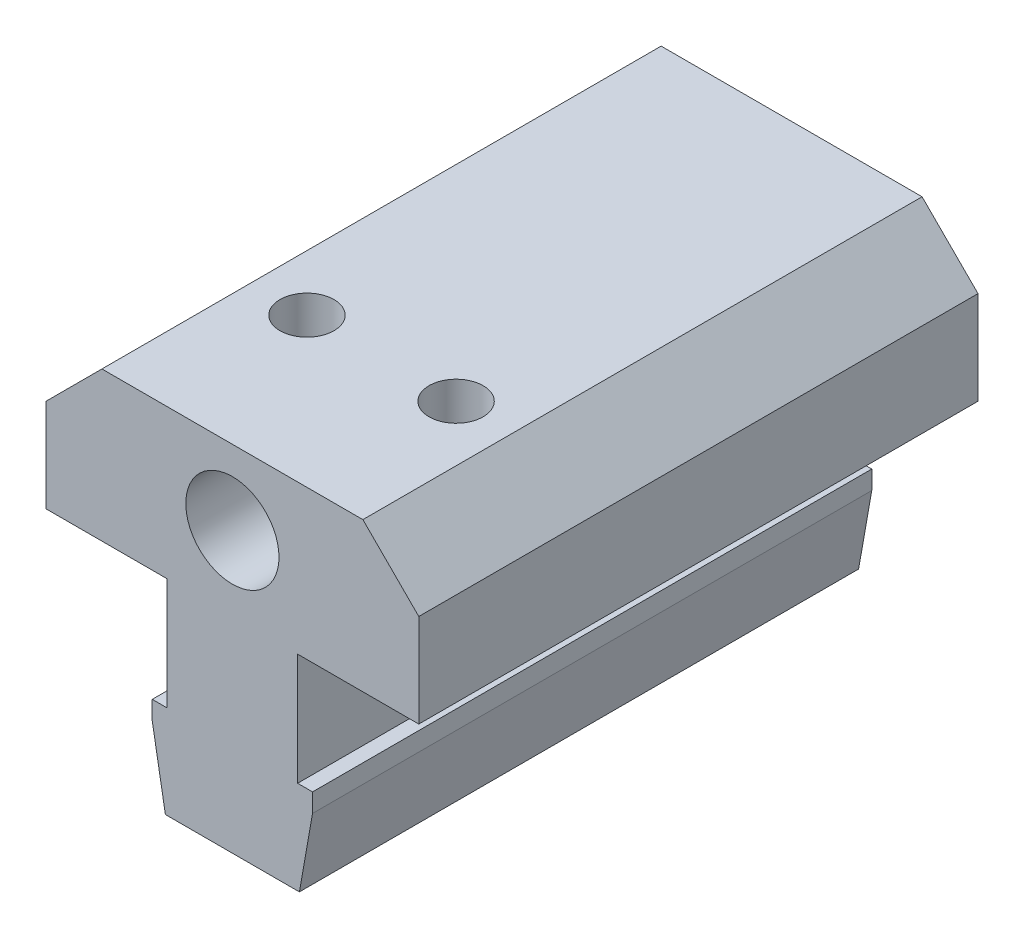
ISO-10303-21;
HEADER;
FILE_DESCRIPTION(('STEP AP214'),'2;1');
FILE_NAME('part.step','',(''),(''),'','','');
FILE_SCHEMA(('AUTOMOTIVE_DESIGN { 1 0 10303 214 1 1 1 1 }'));
ENDSEC;
DATA;
#1=APPLICATION_CONTEXT('core data for automotive mechanical design processes');
#2=APPLICATION_PROTOCOL_DEFINITION('international standard','automotive_design',2000,#1);
#3=PRODUCT_CONTEXT('',#1,'mechanical');
#4=PRODUCT('Part','Part','',(#3));
#5=PRODUCT_RELATED_PRODUCT_CATEGORY('part','',(#4));
#6=PRODUCT_DEFINITION_FORMATION('','',#4);
#7=PRODUCT_DEFINITION_CONTEXT('part definition',#1,'design');
#8=PRODUCT_DEFINITION('design','',#6,#7);
#9=PRODUCT_DEFINITION_SHAPE('','',#8);
#10=(LENGTH_UNIT() NAMED_UNIT(*) SI_UNIT(.MILLI.,.METRE.));
#11=(NAMED_UNIT(*) PLANE_ANGLE_UNIT() SI_UNIT($,.RADIAN.));
#12=(NAMED_UNIT(*) SI_UNIT($,.STERADIAN.) SOLID_ANGLE_UNIT());
#13=UNCERTAINTY_MEASURE_WITH_UNIT(LENGTH_MEASURE(1.E-05),#10,'distance_accuracy_value','');
#14=(GEOMETRIC_REPRESENTATION_CONTEXT(3) GLOBAL_UNCERTAINTY_ASSIGNED_CONTEXT((#13)) GLOBAL_UNIT_ASSIGNED_CONTEXT((#10,
#11,#12)) REPRESENTATION_CONTEXT('',''));
#15=CARTESIAN_POINT('',(0.,0.,0.));
#16=DIRECTION('',(0.,0.,1.));
#17=DIRECTION('',(1.,0.,0.));
#18=AXIS2_PLACEMENT_3D('',#15,#16,#17);
#19=CARTESIAN_POINT('',(0.,-8.,30.));
#20=DIRECTION('',(1.,0.,0.));
#21=DIRECTION('',(0.,0.,-1.));
#22=AXIS2_PLACEMENT_3D('',#19,#20,#21);
#23=PLANE('',#22);
#24=DIRECTION('',(0.,-1.,0.));
#25=VECTOR('',#24,1.);
#26=CARTESIAN_POINT('',(0.,-8.,30.));
#27=LINE('',#26,#25);
#28=CARTESIAN_POINT('',(0.,-3.00000000000001,30.));
#29=VERTEX_POINT('',#28);
#30=CARTESIAN_POINT('',(0.,-8.,30.));
#31=VERTEX_POINT('',#30);
#32=EDGE_CURVE('E248',#29,#31,#27,.T.);
#33=ORIENTED_EDGE('',*,*,#32,.F.);
#34=DIRECTION('',(0.,0.,-1.));
#35=VECTOR('',#34,1.);
#36=CARTESIAN_POINT('',(0.,-3.00000000000001,30.));
#37=LINE('',#36,#35);
#38=CARTESIAN_POINT('',(0.,-3.00000000000001,0.));
#39=VERTEX_POINT('',#38);
#40=EDGE_CURVE('E383',#29,#39,#37,.T.);
#41=ORIENTED_EDGE('',*,*,#40,.T.);
#42=DIRECTION('',(0.,-1.,0.));
#43=VECTOR('',#42,1.);
#44=CARTESIAN_POINT('',(0.,-8.,0.));
#45=LINE('',#44,#43);
#46=CARTESIAN_POINT('',(0.,-8.,0.));
#47=VERTEX_POINT('',#46);
#48=EDGE_CURVE('E281',#39,#47,#45,.T.);
#49=ORIENTED_EDGE('',*,*,#48,.T.);
#50=DIRECTION('',(0.,0.,-1.));
#51=VECTOR('',#50,1.);
#52=CARTESIAN_POINT('',(0.,-8.,30.));
#53=LINE('',#52,#51);
#54=EDGE_CURVE('E207',#31,#47,#53,.T.);
#55=ORIENTED_EDGE('',*,*,#54,.F.);
#56=EDGE_LOOP('',(#33,#41,#49,#55));
#57=FACE_BOUND('',#56,.T.);
#58=ADVANCED_FACE('F47',(#57),#23,.F.);
#59=CARTESIAN_POINT('',(6.5,-8.,30.));
#60=DIRECTION('',(0.,1.,0.));
#61=DIRECTION('',(0.,0.,1.));
#62=AXIS2_PLACEMENT_3D('',#59,#60,#61);
#63=PLANE('',#62);
#64=DIRECTION('',(0.,0.,-1.));
#65=VECTOR('',#64,1.);
#66=CARTESIAN_POINT('',(6.5,-8.,30.));
#67=LINE('',#66,#65);
#68=CARTESIAN_POINT('',(6.5,-8.,20.6389342411184));
#69=VERTEX_POINT('',#68);
#70=CARTESIAN_POINT('',(6.5,-8.,0.));
#71=VERTEX_POINT('',#70);
#72=EDGE_CURVE('E184',#69,#71,#67,.T.);
#73=ORIENTED_EDGE('',*,*,#72,.F.);
#74=CARTESIAN_POINT('',(6.,-8.,22.));
#75=DIRECTION('',(0.,1.,0.));
#76=DIRECTION('',(0.,0.,1.));
#77=AXIS2_PLACEMENT_3D('',#74,#75,#76);
#78=CIRCLE('',#77,1.45);
#79=CARTESIAN_POINT('',(6.5,-8.,23.3610657588816));
#80=VERTEX_POINT('',#79);
#81=EDGE_CURVE('E190',#69,#80,#78,.T.);
#82=ORIENTED_EDGE('',*,*,#81,.T.);
#83=CARTESIAN_POINT('',(6.5,-8.,30.));
#84=VERTEX_POINT('',#83);
#85=EDGE_CURVE('E183',#84,#80,#67,.T.);
#86=ORIENTED_EDGE('',*,*,#85,.F.);
#87=DIRECTION('',(1.,0.,0.));
#88=VECTOR('',#87,1.);
#89=CARTESIAN_POINT('',(6.5,-8.,30.));
#90=LINE('',#89,#88);
#91=EDGE_CURVE('E315',#31,#84,#90,.T.);
#92=ORIENTED_EDGE('',*,*,#91,.F.);
#93=ORIENTED_EDGE('',*,*,#54,.T.);
#94=DIRECTION('',(1.,0.,0.));
#95=VECTOR('',#94,1.);
#96=CARTESIAN_POINT('',(6.5,-8.,0.));
#97=LINE('',#96,#95);
#98=EDGE_CURVE('E278',#47,#71,#97,.T.);
#99=ORIENTED_EDGE('',*,*,#98,.T.);
#100=EDGE_LOOP('',(#73,#82,#86,#92,#93,#99));
#101=FACE_BOUND('',#100,.T.);
#102=ADVANCED_FACE('F197',(#101),#63,.F.);
#103=CARTESIAN_POINT('',(6.5,-14.,30.));
#104=DIRECTION('',(1.,0.,0.));
#105=DIRECTION('',(0.,1.,0.));
#106=AXIS2_PLACEMENT_3D('',#103,#104,#105);
#107=PLANE('',#106);
#108=DIRECTION('',(0.,-1.,0.));
#109=VECTOR('',#108,1.);
#110=CARTESIAN_POINT('',(6.5,-14.,0.));
#111=LINE('',#110,#109);
#112=CARTESIAN_POINT('',(6.5,-14.,0.));
#113=VERTEX_POINT('',#112);
#114=EDGE_CURVE('E275',#71,#113,#111,.T.);
#115=ORIENTED_EDGE('',*,*,#114,.T.);
#116=DIRECTION('',(0.,0.,-1.));
#117=VECTOR('',#116,1.);
#118=CARTESIAN_POINT('',(6.5,-14.,30.));
#119=LINE('',#118,#117);
#120=CARTESIAN_POINT('',(6.5,-14.,30.));
#121=VERTEX_POINT('',#120);
#122=EDGE_CURVE('E214',#121,#113,#119,.T.);
#123=ORIENTED_EDGE('',*,*,#122,.F.);
#124=DIRECTION('',(0.,-1.,0.));
#125=VECTOR('',#124,1.);
#126=CARTESIAN_POINT('',(6.5,-14.,30.));
#127=LINE('',#126,#125);
#128=EDGE_CURVE('E205',#84,#121,#127,.T.);
#129=ORIENTED_EDGE('',*,*,#128,.F.);
#130=ORIENTED_EDGE('',*,*,#85,.T.);
#131=EDGE_CURVE('E175',#80,#69,#67,.T.);
#132=ORIENTED_EDGE('',*,*,#131,.T.);
#133=ORIENTED_EDGE('',*,*,#72,.T.);
#134=EDGE_LOOP('',(#115,#123,#129,#130,#132,#133));
#135=FACE_BOUND('',#134,.T.);
#136=ADVANCED_FACE('F203',(#135),#107,.F.);
#137=CARTESIAN_POINT('',(5.7,-14.,30.));
#138=DIRECTION('',(0.,-1.,0.));
#139=DIRECTION('',(1.,0.,0.));
#140=AXIS2_PLACEMENT_3D('',#137,#138,#139);
#141=PLANE('',#140);
#142=DIRECTION('',(-1.,0.,0.));
#143=VECTOR('',#142,1.);
#144=CARTESIAN_POINT('',(5.7,-14.,0.));
#145=LINE('',#144,#143);
#146=CARTESIAN_POINT('',(5.7,-14.,0.));
#147=VERTEX_POINT('',#146);
#148=EDGE_CURVE('E272',#113,#147,#145,.T.);
#149=ORIENTED_EDGE('',*,*,#148,.T.);
#150=DIRECTION('',(0.,0.,-1.));
#151=VECTOR('',#150,1.);
#152=CARTESIAN_POINT('',(5.7,-14.,30.));
#153=LINE('',#152,#151);
#154=CARTESIAN_POINT('',(5.7,-14.,30.));
#155=VERTEX_POINT('',#154);
#156=EDGE_CURVE('E217',#155,#147,#153,.T.);
#157=ORIENTED_EDGE('',*,*,#156,.F.);
#158=DIRECTION('',(-1.,0.,0.));
#159=VECTOR('',#158,1.);
#160=CARTESIAN_POINT('',(5.7,-14.,30.));
#161=LINE('',#160,#159);
#162=EDGE_CURVE('E310',#121,#155,#161,.T.);
#163=ORIENTED_EDGE('',*,*,#162,.F.);
#164=ORIENTED_EDGE('',*,*,#122,.T.);
#165=EDGE_LOOP('',(#149,#157,#163,#164));
#166=FACE_BOUND('',#165,.T.);
#167=ADVANCED_FACE('F425',(#166),#141,.F.);
#168=CARTESIAN_POINT('',(5.7,-19.,30.));
#169=DIRECTION('',(1.,0.,0.));
#170=DIRECTION('',(0.,0.,-1.));
#171=AXIS2_PLACEMENT_3D('',#168,#169,#170);
#172=PLANE('',#171);
#173=DIRECTION('',(0.,-1.,0.));
#174=VECTOR('',#173,1.);
#175=CARTESIAN_POINT('',(5.7,-19.,0.));
#176=LINE('',#175,#174);
#177=CARTESIAN_POINT('',(5.7,-14.9999999999999,0.));
#178=VERTEX_POINT('',#177);
#179=EDGE_CURVE('E269',#147,#178,#176,.T.);
#180=ORIENTED_EDGE('',*,*,#179,.T.);
#181=DIRECTION('',(0.,0.,1.));
#182=VECTOR('',#181,1.);
#183=CARTESIAN_POINT('',(5.7,-14.9999999999999,30.));
#184=LINE('',#183,#182);
#185=CARTESIAN_POINT('',(5.7,-14.9999999999999,30.));
#186=VERTEX_POINT('',#185);
#187=EDGE_CURVE('E11',#178,#186,#184,.T.);
#188=ORIENTED_EDGE('',*,*,#187,.T.);
#189=DIRECTION('',(0.,-1.,0.));
#190=VECTOR('',#189,1.);
#191=CARTESIAN_POINT('',(5.7,-19.,30.));
#192=LINE('',#191,#190);
#193=EDGE_CURVE('E307',#155,#186,#192,.T.);
#194=ORIENTED_EDGE('',*,*,#193,.F.);
#195=ORIENTED_EDGE('',*,*,#156,.T.);
#196=EDGE_LOOP('',(#180,#188,#194,#195));
#197=FACE_BOUND('',#196,.T.);
#198=ADVANCED_FACE('F427',(#197),#172,.F.);
#199=CARTESIAN_POINT('',(14.3,-19.,30.));
#200=DIRECTION('',(0.,1.,0.));
#201=DIRECTION('',(0.,0.,1.));
#202=AXIS2_PLACEMENT_3D('',#199,#200,#201);
#203=PLANE('',#202);
#204=DIRECTION('',(1.,0.,0.));
#205=VECTOR('',#204,1.);
#206=CARTESIAN_POINT('',(14.3,-19.,0.));
#207=LINE('',#206,#205);
#208=CARTESIAN_POINT('',(6.40530792283387,-19.,0.));
#209=VERTEX_POINT('',#208);
#210=CARTESIAN_POINT('',(13.5946920771661,-19.,0.));
#211=VERTEX_POINT('',#210);
#212=EDGE_CURVE('E266',#209,#211,#207,.T.);
#213=ORIENTED_EDGE('',*,*,#212,.T.);
#214=DIRECTION('',(0.,0.,1.));
#215=VECTOR('',#214,1.);
#216=CARTESIAN_POINT('',(13.5946920771661,-19.,30.));
#217=LINE('',#216,#215);
#218=CARTESIAN_POINT('',(13.5946920771661,-19.,30.));
#219=VERTEX_POINT('',#218);
#220=EDGE_CURVE('E70',#211,#219,#217,.T.);
#221=ORIENTED_EDGE('',*,*,#220,.T.);
#222=DIRECTION('',(1.,0.,0.));
#223=VECTOR('',#222,1.);
#224=CARTESIAN_POINT('',(14.3,-19.,30.));
#225=LINE('',#224,#223);
#226=CARTESIAN_POINT('',(6.40530792283387,-19.,30.));
#227=VERTEX_POINT('',#226);
#228=EDGE_CURVE('E304',#227,#219,#225,.T.);
#229=ORIENTED_EDGE('',*,*,#228,.F.);
#230=DIRECTION('',(0.,0.,-1.));
#231=VECTOR('',#230,1.);
#232=CARTESIAN_POINT('',(6.40530792283387,-19.,30.));
#233=LINE('',#232,#231);
#234=EDGE_CURVE('E372',#227,#209,#233,.T.);
#235=ORIENTED_EDGE('',*,*,#234,.T.);
#236=EDGE_LOOP('',(#213,#221,#229,#235));
#237=FACE_BOUND('',#236,.T.);
#238=ADVANCED_FACE('F430',(#237),#203,.F.);
#239=CARTESIAN_POINT('',(14.3,-14.,30.));
#240=DIRECTION('',(-1.,0.,0.));
#241=DIRECTION('',(0.,0.,1.));
#242=AXIS2_PLACEMENT_3D('',#239,#240,#241);
#243=PLANE('',#242);
#244=DIRECTION('',(0.,1.,0.));
#245=VECTOR('',#244,1.);
#246=CARTESIAN_POINT('',(14.3,-14.,30.));
#247=LINE('',#246,#245);
#248=CARTESIAN_POINT('',(14.3,-14.9999999999999,30.));
#249=VERTEX_POINT('',#248);
#250=CARTESIAN_POINT('',(14.3,-14.,30.));
#251=VERTEX_POINT('',#250);
#252=EDGE_CURVE('E301',#249,#251,#247,.T.);
#253=ORIENTED_EDGE('',*,*,#252,.F.);
#254=DIRECTION('',(0.,0.,-1.));
#255=VECTOR('',#254,1.);
#256=CARTESIAN_POINT('',(14.3,-14.9999999999999,30.));
#257=LINE('',#256,#255);
#258=CARTESIAN_POINT('',(14.3,-14.9999999999999,0.));
#259=VERTEX_POINT('',#258);
#260=EDGE_CURVE('E365',#249,#259,#257,.T.);
#261=ORIENTED_EDGE('',*,*,#260,.T.);
#262=DIRECTION('',(0.,1.,0.));
#263=VECTOR('',#262,1.);
#264=CARTESIAN_POINT('',(14.3,-14.,0.));
#265=LINE('',#264,#263);
#266=CARTESIAN_POINT('',(14.3,-14.,0.));
#267=VERTEX_POINT('',#266);
#268=EDGE_CURVE('E263',#259,#267,#265,.T.);
#269=ORIENTED_EDGE('',*,*,#268,.T.);
#270=DIRECTION('',(0.,0.,-1.));
#271=VECTOR('',#270,1.);
#272=CARTESIAN_POINT('',(14.3,-14.,30.));
#273=LINE('',#272,#271);
#274=EDGE_CURVE('E223',#251,#267,#273,.T.);
#275=ORIENTED_EDGE('',*,*,#274,.F.);
#276=EDGE_LOOP('',(#253,#261,#269,#275));
#277=FACE_BOUND('',#276,.T.);
#278=ADVANCED_FACE('F433',(#277),#243,.F.);
#279=CARTESIAN_POINT('',(13.5,-14.,30.));
#280=DIRECTION('',(0.,-1.,0.));
#281=DIRECTION('',(1.,0.,0.));
#282=AXIS2_PLACEMENT_3D('',#279,#280,#281);
#283=PLANE('',#282);
#284=DIRECTION('',(-1.,0.,0.));
#285=VECTOR('',#284,1.);
#286=CARTESIAN_POINT('',(13.5,-14.,0.));
#287=LINE('',#286,#285);
#288=CARTESIAN_POINT('',(13.5,-14.,0.));
#289=VERTEX_POINT('',#288);
#290=EDGE_CURVE('E260',#267,#289,#287,.T.);
#291=ORIENTED_EDGE('',*,*,#290,.T.);
#292=DIRECTION('',(0.,0.,-1.));
#293=VECTOR('',#292,1.);
#294=CARTESIAN_POINT('',(13.5,-14.,30.));
#295=LINE('',#294,#293);
#296=CARTESIAN_POINT('',(13.5,-14.,30.));
#297=VERTEX_POINT('',#296);
#298=EDGE_CURVE('E229',#297,#289,#295,.T.);
#299=ORIENTED_EDGE('',*,*,#298,.F.);
#300=DIRECTION('',(-1.,0.,0.));
#301=VECTOR('',#300,1.);
#302=CARTESIAN_POINT('',(13.5,-14.,30.));
#303=LINE('',#302,#301);
#304=EDGE_CURVE('E298',#251,#297,#303,.T.);
#305=ORIENTED_EDGE('',*,*,#304,.F.);
#306=ORIENTED_EDGE('',*,*,#274,.T.);
#307=EDGE_LOOP('',(#291,#299,#305,#306));
#308=FACE_BOUND('',#307,.T.);
#309=ADVANCED_FACE('F440',(#308),#283,.F.);
#310=CARTESIAN_POINT('',(13.5,-8.,30.));
#311=DIRECTION('',(-1.,0.,0.));
#312=DIRECTION('',(0.,-1.,0.));
#313=AXIS2_PLACEMENT_3D('',#310,#311,#312);
#314=PLANE('',#313);
#315=DIRECTION('',(0.,1.,0.));
#316=VECTOR('',#315,1.);
#317=CARTESIAN_POINT('',(13.5,-8.,0.));
#318=LINE('',#317,#316);
#319=CARTESIAN_POINT('',(13.5,-8.,0.));
#320=VERTEX_POINT('',#319);
#321=EDGE_CURVE('E256',#289,#320,#318,.T.);
#322=ORIENTED_EDGE('',*,*,#321,.T.);
#323=DIRECTION('',(0.,0.,-1.));
#324=VECTOR('',#323,1.);
#325=CARTESIAN_POINT('',(13.5,-8.,30.));
#326=LINE('',#325,#324);
#327=CARTESIAN_POINT('',(13.5,-8.,20.6389342411184));
#328=VERTEX_POINT('',#327);
#329=EDGE_CURVE('E238',#328,#320,#326,.T.);
#330=ORIENTED_EDGE('',*,*,#329,.F.);
#331=CARTESIAN_POINT('',(13.5,-8.,23.3610657588816));
#332=VERTEX_POINT('',#331);
#333=EDGE_CURVE('E237',#332,#328,#326,.T.);
#334=ORIENTED_EDGE('',*,*,#333,.F.);
#335=CARTESIAN_POINT('',(13.5,-8.,30.));
#336=VERTEX_POINT('',#335);
#337=EDGE_CURVE('E233',#336,#332,#326,.T.);
#338=ORIENTED_EDGE('',*,*,#337,.F.);
#339=DIRECTION('',(0.,1.,0.));
#340=VECTOR('',#339,1.);
#341=CARTESIAN_POINT('',(13.5,-8.,30.));
#342=LINE('',#341,#340);
#343=EDGE_CURVE('E295',#297,#336,#342,.T.);
#344=ORIENTED_EDGE('',*,*,#343,.F.);
#345=ORIENTED_EDGE('',*,*,#298,.T.);
#346=EDGE_LOOP('',(#322,#330,#334,#338,#344,#345));
#347=FACE_BOUND('',#346,.T.);
#348=ADVANCED_FACE('F443',(#347),#314,.F.);
#349=CARTESIAN_POINT('',(20.,-8.,30.));
#350=DIRECTION('',(0.,1.,0.));
#351=DIRECTION('',(0.,0.,1.));
#352=AXIS2_PLACEMENT_3D('',#349,#350,#351);
#353=PLANE('',#352);
#354=ORIENTED_EDGE('',*,*,#337,.T.);
#355=CARTESIAN_POINT('',(14.,-8.,22.));
#356=DIRECTION('',(0.,1.,0.));
#357=DIRECTION('',(0.,0.,1.));
#358=AXIS2_PLACEMENT_3D('',#355,#356,#357);
#359=CIRCLE('',#358,1.45);
#360=EDGE_CURVE('E327',#332,#328,#359,.T.);
#361=ORIENTED_EDGE('',*,*,#360,.T.);
#362=ORIENTED_EDGE('',*,*,#329,.T.);
#363=DIRECTION('',(1.,0.,0.));
#364=VECTOR('',#363,1.);
#365=CARTESIAN_POINT('',(20.,-8.,0.));
#366=LINE('',#365,#364);
#367=CARTESIAN_POINT('',(20.,-8.,0.));
#368=VERTEX_POINT('',#367);
#369=EDGE_CURVE('E253',#320,#368,#366,.T.);
#370=ORIENTED_EDGE('',*,*,#369,.T.);
#371=DIRECTION('',(0.,0.,-1.));
#372=VECTOR('',#371,1.);
#373=CARTESIAN_POINT('',(20.,-8.,30.));
#374=LINE('',#373,#372);
#375=CARTESIAN_POINT('',(20.,-8.,30.));
#376=VERTEX_POINT('',#375);
#377=EDGE_CURVE('E239',#376,#368,#374,.T.);
#378=ORIENTED_EDGE('',*,*,#377,.F.);
#379=DIRECTION('',(1.,0.,0.));
#380=VECTOR('',#379,1.);
#381=CARTESIAN_POINT('',(20.,-8.,30.));
#382=LINE('',#381,#380);
#383=EDGE_CURVE('E292',#336,#376,#382,.T.);
#384=ORIENTED_EDGE('',*,*,#383,.F.);
#385=EDGE_LOOP('',(#354,#361,#362,#370,#378,#384));
#386=FACE_BOUND('',#385,.T.);
#387=ADVANCED_FACE('F451',(#386),#353,.F.);
#388=CARTESIAN_POINT('',(20.,0.,30.));
#389=DIRECTION('',(-1.,0.,0.));
#390=DIRECTION('',(0.,-1.,0.));
#391=AXIS2_PLACEMENT_3D('',#388,#389,#390);
#392=PLANE('',#391);
#393=DIRECTION('',(0.,1.,0.));
#394=VECTOR('',#393,1.);
#395=CARTESIAN_POINT('',(20.,0.,0.));
#396=LINE('',#395,#394);
#397=CARTESIAN_POINT('',(20.,-3.00000000000001,0.));
#398=VERTEX_POINT('',#397);
#399=EDGE_CURVE('E249',#368,#398,#396,.T.);
#400=ORIENTED_EDGE('',*,*,#399,.T.);
#401=DIRECTION('',(0.,0.,1.));
#402=VECTOR('',#401,1.);
#403=CARTESIAN_POINT('',(20.,-3.00000000000001,30.));
#404=LINE('',#403,#402);
#405=CARTESIAN_POINT('',(20.,-3.00000000000001,30.));
#406=VERTEX_POINT('',#405);
#407=EDGE_CURVE('E393',#398,#406,#404,.T.);
#408=ORIENTED_EDGE('',*,*,#407,.T.);
#409=DIRECTION('',(0.,1.,0.));
#410=VECTOR('',#409,1.);
#411=CARTESIAN_POINT('',(20.,0.,30.));
#412=LINE('',#411,#410);
#413=EDGE_CURVE('E288',#376,#406,#412,.T.);
#414=ORIENTED_EDGE('',*,*,#413,.F.);
#415=ORIENTED_EDGE('',*,*,#377,.T.);
#416=EDGE_LOOP('',(#400,#408,#414,#415));
#417=FACE_BOUND('',#416,.T.);
#418=ADVANCED_FACE('F458',(#417),#392,.F.);
#419=CARTESIAN_POINT('',(0.,0.,30.));
#420=DIRECTION('',(0.,-1.,0.));
#421=DIRECTION('',(0.,0.,-1.));
#422=AXIS2_PLACEMENT_3D('',#419,#420,#421);
#423=PLANE('',#422);
#424=CARTESIAN_POINT('',(14.,0.,22.));
#425=DIRECTION('',(0.,1.,0.));
#426=DIRECTION('',(0.,0.,1.));
#427=AXIS2_PLACEMENT_3D('',#424,#425,#426);
#428=CIRCLE('',#427,1.45);
#429=CARTESIAN_POINT('',(14.,0.,23.45));
#430=VERTEX_POINT('',#429);
#431=EDGE_CURVE('E323',#430,#430,#428,.T.);
#432=ORIENTED_EDGE('',*,*,#431,.F.);
#433=EDGE_LOOP('',(#432));
#434=FACE_BOUND('',#433,.T.);
#435=CARTESIAN_POINT('',(6.,0.,22.));
#436=DIRECTION('',(0.,1.,0.));
#437=DIRECTION('',(0.,0.,1.));
#438=AXIS2_PLACEMENT_3D('',#435,#436,#437);
#439=CIRCLE('',#438,1.45);
#440=CARTESIAN_POINT('',(6.,0.,23.45));
#441=VERTEX_POINT('',#440);
#442=EDGE_CURVE('E193',#441,#441,#439,.T.);
#443=ORIENTED_EDGE('',*,*,#442,.F.);
#444=EDGE_LOOP('',(#443));
#445=FACE_BOUND('',#444,.T.);
#446=DIRECTION('',(-1.,0.,0.));
#447=VECTOR('',#446,1.);
#448=CARTESIAN_POINT('',(0.,0.,30.));
#449=LINE('',#448,#447);
#450=CARTESIAN_POINT('',(17.,0.,30.));
#451=VERTEX_POINT('',#450);
#452=CARTESIAN_POINT('',(3.00000000000001,0.,30.));
#453=VERTEX_POINT('',#452);
#454=EDGE_CURVE('E243',#451,#453,#449,.T.);
#455=ORIENTED_EDGE('',*,*,#454,.F.);
#456=DIRECTION('',(0.,0.,-1.));
#457=VECTOR('',#456,1.);
#458=CARTESIAN_POINT('',(17.,0.,30.));
#459=LINE('',#458,#457);
#460=CARTESIAN_POINT('',(17.,0.,0.));
#461=VERTEX_POINT('',#460);
#462=EDGE_CURVE('E402',#451,#461,#459,.T.);
#463=ORIENTED_EDGE('',*,*,#462,.T.);
#464=DIRECTION('',(-1.,0.,0.));
#465=VECTOR('',#464,1.);
#466=CARTESIAN_POINT('',(0.,0.,0.));
#467=LINE('',#466,#465);
#468=CARTESIAN_POINT('',(3.00000000000001,0.,0.));
#469=VERTEX_POINT('',#468);
#470=EDGE_CURVE('E244',#461,#469,#467,.T.);
#471=ORIENTED_EDGE('',*,*,#470,.T.);
#472=DIRECTION('',(0.,0.,1.));
#473=VECTOR('',#472,1.);
#474=CARTESIAN_POINT('',(3.00000000000001,0.,30.));
#475=LINE('',#474,#473);
#476=EDGE_CURVE('E210',#469,#453,#475,.T.);
#477=ORIENTED_EDGE('',*,*,#476,.T.);
#478=EDGE_LOOP('',(#455,#463,#471,#477));
#479=FACE_BOUND('',#478,.T.);
#480=ADVANCED_FACE('F353',(#434,#445,#479),#423,.F.);
#481=CARTESIAN_POINT('',(0.,0.,30.));
#482=DIRECTION('',(0.,0.,-1.));
#483=DIRECTION('',(-1.,0.,0.));
#484=AXIS2_PLACEMENT_3D('',#481,#482,#483);
#485=PLANE('',#484);
#486=CARTESIAN_POINT('',(10.,-4.,30.));
#487=DIRECTION('',(0.,0.,1.));
#488=DIRECTION('',(1.,0.,0.));
#489=AXIS2_PLACEMENT_3D('',#486,#487,#488);
#490=CIRCLE('',#489,2.5);
#491=CARTESIAN_POINT('',(12.5,-4.,30.));
#492=VERTEX_POINT('',#491);
#493=EDGE_CURVE('E331',#492,#492,#490,.T.);
#494=ORIENTED_EDGE('',*,*,#493,.F.);
#495=EDGE_LOOP('',(#494));
#496=FACE_BOUND('',#495,.T.);
#497=ORIENTED_EDGE('',*,*,#228,.T.);
#498=DIRECTION('',(-0.173648177666928,-0.984807753012209,0.));
#499=VECTOR('',#498,1.);
#500=CARTESIAN_POINT('',(14.3,-14.9999999999999,30.));
#501=LINE('',#500,#499);
#502=EDGE_CURVE('E57',#219,#249,#501,.F.);
#503=ORIENTED_EDGE('',*,*,#502,.T.);
#504=ORIENTED_EDGE('',*,*,#252,.T.);
#505=ORIENTED_EDGE('',*,*,#304,.T.);
#506=ORIENTED_EDGE('',*,*,#343,.T.);
#507=ORIENTED_EDGE('',*,*,#383,.T.);
#508=ORIENTED_EDGE('',*,*,#413,.T.);
#509=DIRECTION('',(0.707106781186548,-0.707106781186548,0.));
#510=VECTOR('',#509,1.);
#511=CARTESIAN_POINT('',(17.,0.,30.));
#512=LINE('',#511,#510);
#513=EDGE_CURVE('E387',#406,#451,#512,.F.);
#514=ORIENTED_EDGE('',*,*,#513,.T.);
#515=ORIENTED_EDGE('',*,*,#454,.T.);
#516=DIRECTION('',(0.707106781186548,0.707106781186548,0.));
#517=VECTOR('',#516,1.);
#518=CARTESIAN_POINT('',(0.,-3.00000000000001,30.));
#519=LINE('',#518,#517);
#520=EDGE_CURVE('E390',#453,#29,#519,.F.);
#521=ORIENTED_EDGE('',*,*,#520,.T.);
#522=ORIENTED_EDGE('',*,*,#32,.T.);
#523=ORIENTED_EDGE('',*,*,#91,.T.);
#524=ORIENTED_EDGE('',*,*,#128,.T.);
#525=ORIENTED_EDGE('',*,*,#162,.T.);
#526=ORIENTED_EDGE('',*,*,#193,.T.);
#527=DIRECTION('',(-0.173648177666928,0.984807753012209,0.));
#528=VECTOR('',#527,1.);
#529=CARTESIAN_POINT('',(6.40530792283387,-19.,30.));
#530=LINE('',#529,#528);
#531=EDGE_CURVE('E358',#186,#227,#530,.F.);
#532=ORIENTED_EDGE('',*,*,#531,.T.);
#533=EDGE_LOOP('',(#497,#503,#504,#505,#506,#507,#508,#514,#515,#521,#522,#523,#524,#525,#526,#532));
#534=FACE_BOUND('',#533,.T.);
#535=ADVANCED_FACE('F350',(#496,#534),#485,.F.);
#536=CARTESIAN_POINT('',(0.,0.,0.));
#537=DIRECTION('',(0.,0.,-1.));
#538=DIRECTION('',(-1.,0.,0.));
#539=AXIS2_PLACEMENT_3D('',#536,#537,#538);
#540=PLANE('',#539);
#541=CARTESIAN_POINT('',(10.,-4.,0.));
#542=DIRECTION('',(0.,0.,1.));
#543=DIRECTION('',(1.,0.,0.));
#544=AXIS2_PLACEMENT_3D('',#541,#542,#543);
#545=CIRCLE('',#544,2.5);
#546=CARTESIAN_POINT('',(12.5,-4.,0.));
#547=VERTEX_POINT('',#546);
#548=EDGE_CURVE('E202',#547,#547,#545,.T.);
#549=ORIENTED_EDGE('',*,*,#548,.T.);
#550=EDGE_LOOP('',(#549));
#551=FACE_BOUND('',#550,.T.);
#552=ORIENTED_EDGE('',*,*,#268,.F.);
#553=DIRECTION('',(0.173648177666928,0.984807753012209,0.));
#554=VECTOR('',#553,1.);
#555=CARTESIAN_POINT('',(16.4339533135617,-2.89774936888417,0.));
#556=LINE('',#555,#554);
#557=EDGE_CURVE('E375',#259,#211,#556,.F.);
#558=ORIENTED_EDGE('',*,*,#557,.T.);
#559=ORIENTED_EDGE('',*,*,#212,.F.);
#560=DIRECTION('',(0.173648177666928,-0.984807753012209,0.));
#561=VECTOR('',#560,1.);
#562=CARTESIAN_POINT('',(2.96297289429738,0.522452064372471,0.));
#563=LINE('',#562,#561);
#564=EDGE_CURVE('E378',#209,#178,#563,.F.);
#565=ORIENTED_EDGE('',*,*,#564,.T.);
#566=ORIENTED_EDGE('',*,*,#179,.F.);
#567=ORIENTED_EDGE('',*,*,#148,.F.);
#568=ORIENTED_EDGE('',*,*,#114,.F.);
#569=ORIENTED_EDGE('',*,*,#98,.F.);
#570=ORIENTED_EDGE('',*,*,#48,.F.);
#571=DIRECTION('',(-0.707106781186548,-0.707106781186548,0.));
#572=VECTOR('',#571,1.);
#573=CARTESIAN_POINT('',(1.50000000000001,-1.50000000000001,0.));
#574=LINE('',#573,#572);
#575=EDGE_CURVE('E399',#39,#469,#574,.F.);
#576=ORIENTED_EDGE('',*,*,#575,.T.);
#577=ORIENTED_EDGE('',*,*,#470,.F.);
#578=DIRECTION('',(-0.707106781186548,0.707106781186548,0.));
#579=VECTOR('',#578,1.);
#580=CARTESIAN_POINT('',(8.49999999999999,8.49999999999999,0.));
#581=LINE('',#580,#579);
#582=EDGE_CURVE('E396',#461,#398,#581,.F.);
#583=ORIENTED_EDGE('',*,*,#582,.T.);
#584=ORIENTED_EDGE('',*,*,#399,.F.);
#585=ORIENTED_EDGE('',*,*,#369,.F.);
#586=ORIENTED_EDGE('',*,*,#321,.F.);
#587=ORIENTED_EDGE('',*,*,#290,.F.);
#588=EDGE_LOOP('',(#552,#558,#559,#565,#566,#567,#568,#569,#570,#576,#577,#583,#584,#585,#586,#587));
#589=FACE_BOUND('',#588,.T.);
#590=ADVANCED_FACE('F339',(#551,#589),#540,.T.);
#591=CARTESIAN_POINT('',(6.,-8.,22.));
#592=DIRECTION('',(0.,1.,0.));
#593=DIRECTION('',(0.,0.,1.));
#594=AXIS2_PLACEMENT_3D('',#591,#592,#593);
#595=PLANE('',#594);
#596=ORIENTED_EDGE('',*,*,#131,.F.);
#597=EDGE_CURVE('E178',#80,#69,#78,.T.);
#598=ORIENTED_EDGE('',*,*,#597,.T.);
#599=EDGE_LOOP('',(#596,#598));
#600=FACE_BOUND('',#599,.T.);
#601=ADVANCED_FACE('F177',(#600),#595,.T.);
#602=CARTESIAN_POINT('',(6.,-8.,22.));
#603=DIRECTION('',(0.,1.,0.));
#604=DIRECTION('',(0.,0.,1.));
#605=AXIS2_PLACEMENT_3D('',#602,#603,#604);
#606=CYLINDRICAL_SURFACE('',#605,1.45);
#607=ORIENTED_EDGE('',*,*,#597,.F.);
#608=ORIENTED_EDGE('',*,*,#81,.F.);
#609=EDGE_LOOP('',(#607,#608));
#610=FACE_BOUND('',#609,.T.);
#611=ORIENTED_EDGE('',*,*,#442,.T.);
#612=EDGE_LOOP('',(#611));
#613=FACE_BOUND('',#612,.T.);
#614=ADVANCED_FACE('F188',(#610,#613),#606,.F.);
#615=CARTESIAN_POINT('',(14.,-8.,22.));
#616=DIRECTION('',(0.,1.,0.));
#617=DIRECTION('',(0.,0.,1.));
#618=AXIS2_PLACEMENT_3D('',#615,#616,#617);
#619=PLANE('',#618);
#620=ORIENTED_EDGE('',*,*,#333,.T.);
#621=EDGE_CURVE('E284',#328,#332,#359,.T.);
#622=ORIENTED_EDGE('',*,*,#621,.T.);
#623=EDGE_LOOP('',(#620,#622));
#624=FACE_BOUND('',#623,.T.);
#625=ADVANCED_FACE('F528',(#624),#619,.T.);
#626=CARTESIAN_POINT('',(14.,-8.,22.));
#627=DIRECTION('',(0.,1.,0.));
#628=DIRECTION('',(0.,0.,1.));
#629=AXIS2_PLACEMENT_3D('',#626,#627,#628);
#630=CYLINDRICAL_SURFACE('',#629,1.45);
#631=ORIENTED_EDGE('',*,*,#621,.F.);
#632=ORIENTED_EDGE('',*,*,#360,.F.);
#633=EDGE_LOOP('',(#631,#632));
#634=FACE_BOUND('',#633,.T.);
#635=ORIENTED_EDGE('',*,*,#431,.T.);
#636=EDGE_LOOP('',(#635));
#637=FACE_BOUND('',#636,.T.);
#638=ADVANCED_FACE('F346',(#634,#637),#630,.F.);
#639=CARTESIAN_POINT('',(10.,-4.,0.));
#640=DIRECTION('',(0.,0.,1.));
#641=DIRECTION('',(1.,0.,0.));
#642=AXIS2_PLACEMENT_3D('',#639,#640,#641);
#643=CYLINDRICAL_SURFACE('',#642,2.5);
#644=ORIENTED_EDGE('',*,*,#548,.F.);
#645=EDGE_LOOP('',(#644));
#646=FACE_BOUND('',#645,.T.);
#647=ORIENTED_EDGE('',*,*,#493,.T.);
#648=EDGE_LOOP('',(#647));
#649=FACE_BOUND('',#648,.T.);
#650=ADVANCED_FACE('F342',(#646,#649),#643,.F.);
#651=CARTESIAN_POINT('',(17.,0.,30.));
#652=DIRECTION('',(-0.707106781186547,-0.707106781186547,0.));
#653=DIRECTION('',(0.,0.,-1.));
#654=AXIS2_PLACEMENT_3D('',#651,#652,#653);
#655=PLANE('',#654);
#656=ORIENTED_EDGE('',*,*,#513,.F.);
#657=ORIENTED_EDGE('',*,*,#407,.F.);
#658=ORIENTED_EDGE('',*,*,#582,.F.);
#659=ORIENTED_EDGE('',*,*,#462,.F.);
#660=EDGE_LOOP('',(#656,#657,#658,#659));
#661=FACE_BOUND('',#660,.T.);
#662=ADVANCED_FACE('F345',(#661),#655,.F.);
#663=CARTESIAN_POINT('',(0.,-3.00000000000001,30.));
#664=DIRECTION('',(0.707106781186547,-0.707106781186547,0.));
#665=DIRECTION('',(0.,0.,-1.));
#666=AXIS2_PLACEMENT_3D('',#663,#664,#665);
#667=PLANE('',#666);
#668=ORIENTED_EDGE('',*,*,#520,.F.);
#669=ORIENTED_EDGE('',*,*,#476,.F.);
#670=ORIENTED_EDGE('',*,*,#575,.F.);
#671=ORIENTED_EDGE('',*,*,#40,.F.);
#672=EDGE_LOOP('',(#668,#669,#670,#671));
#673=FACE_BOUND('',#672,.T.);
#674=ADVANCED_FACE('F417',(#673),#667,.F.);
#675=CARTESIAN_POINT('',(14.3,-14.9999999999999,30.));
#676=DIRECTION('',(-0.984807753012208,0.173648177666928,0.));
#677=DIRECTION('',(0.,0.,-1.));
#678=AXIS2_PLACEMENT_3D('',#675,#676,#677);
#679=PLANE('',#678);
#680=ORIENTED_EDGE('',*,*,#502,.F.);
#681=ORIENTED_EDGE('',*,*,#220,.F.);
#682=ORIENTED_EDGE('',*,*,#557,.F.);
#683=ORIENTED_EDGE('',*,*,#260,.F.);
#684=EDGE_LOOP('',(#680,#681,#682,#683));
#685=FACE_BOUND('',#684,.T.);
#686=ADVANCED_FACE('F363',(#685),#679,.F.);
#687=CARTESIAN_POINT('',(6.40530792283387,-19.,30.));
#688=DIRECTION('',(0.984807753012208,0.173648177666928,0.));
#689=DIRECTION('',(0.,0.,-1.));
#690=AXIS2_PLACEMENT_3D('',#687,#688,#689);
#691=PLANE('',#690);
#692=ORIENTED_EDGE('',*,*,#531,.F.);
#693=ORIENTED_EDGE('',*,*,#187,.F.);
#694=ORIENTED_EDGE('',*,*,#564,.F.);
#695=ORIENTED_EDGE('',*,*,#234,.F.);
#696=EDGE_LOOP('',(#692,#693,#694,#695));
#697=FACE_BOUND('',#696,.T.);
#698=ADVANCED_FACE('F50',(#697),#691,.F.);
#699=CLOSED_SHELL('',(#58,#102,#136,#167,#198,#238,#278,#309,#348,#387,#418,#480,#535,#590,#601,
#614,#625,#638,#650,#662,#674,#686,#698));
#700=MANIFOLD_SOLID_BREP('B2',#699);
#701=ADVANCED_BREP_SHAPE_REPRESENTATION('',(#18,#700),#14);
#702=SHAPE_DEFINITION_REPRESENTATION(#9,#701);
ENDSEC;
END-ISO-10303-21;
